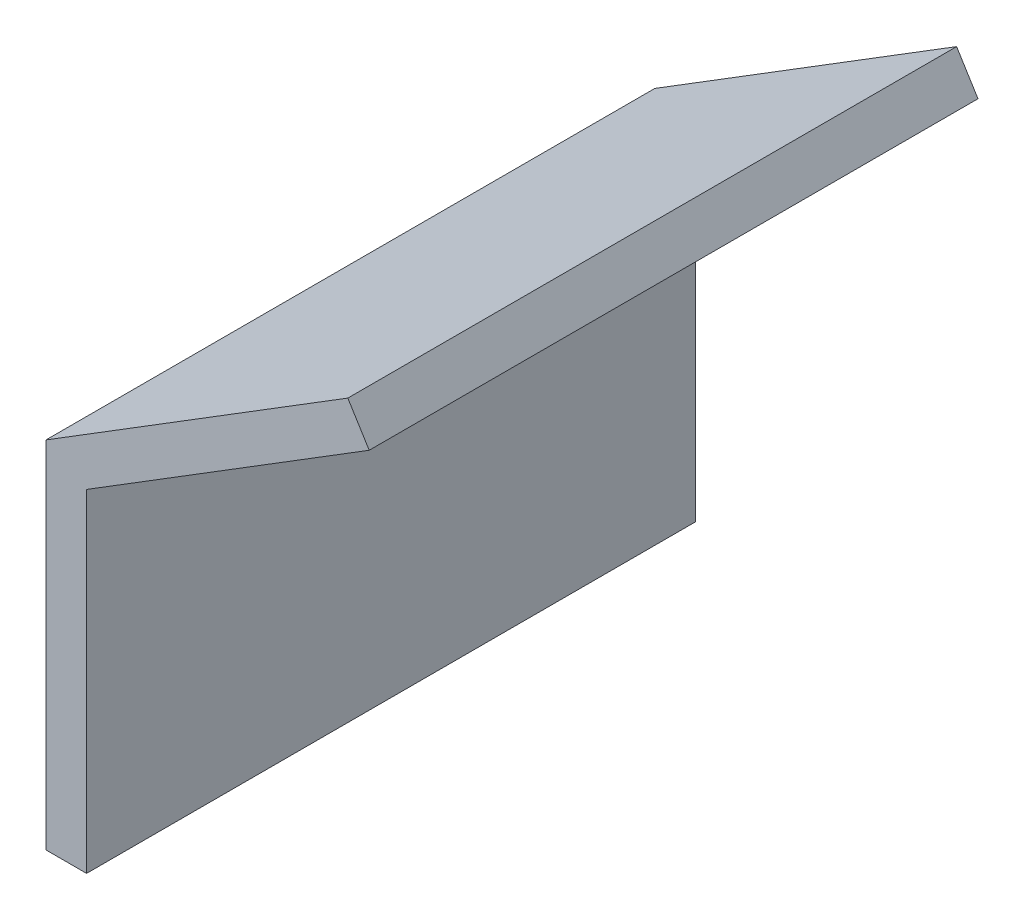
ISO-10303-21;
HEADER;
FILE_DESCRIPTION(('STEP AP214'),'2;1');
FILE_NAME('part.step','',(''),(''),'','','');
FILE_SCHEMA(('AUTOMOTIVE_DESIGN { 1 0 10303 214 1 1 1 1 }'));
ENDSEC;
DATA;
#1=APPLICATION_CONTEXT('core data for automotive mechanical design processes');
#2=APPLICATION_PROTOCOL_DEFINITION('international standard','automotive_design',2000,#1);
#3=PRODUCT_CONTEXT('',#1,'mechanical');
#4=PRODUCT('Part','Part','',(#3));
#5=PRODUCT_RELATED_PRODUCT_CATEGORY('part','',(#4));
#6=PRODUCT_DEFINITION_FORMATION('','',#4);
#7=PRODUCT_DEFINITION_CONTEXT('part definition',#1,'design');
#8=PRODUCT_DEFINITION('design','',#6,#7);
#9=PRODUCT_DEFINITION_SHAPE('','',#8);
#10=(LENGTH_UNIT() NAMED_UNIT(*) SI_UNIT(.MILLI.,.METRE.));
#11=(NAMED_UNIT(*) PLANE_ANGLE_UNIT() SI_UNIT($,.RADIAN.));
#12=(NAMED_UNIT(*) SI_UNIT($,.STERADIAN.) SOLID_ANGLE_UNIT());
#13=UNCERTAINTY_MEASURE_WITH_UNIT(LENGTH_MEASURE(1.E-05),#10,'distance_accuracy_value','');
#14=(GEOMETRIC_REPRESENTATION_CONTEXT(3) GLOBAL_UNCERTAINTY_ASSIGNED_CONTEXT((#13)) GLOBAL_UNIT_ASSIGNED_CONTEXT((#10,
#11,#12)) REPRESENTATION_CONTEXT('',''));
#15=CARTESIAN_POINT('',(0.,0.,0.));
#16=DIRECTION('',(0.,0.,1.));
#17=DIRECTION('',(1.,0.,0.));
#18=AXIS2_PLACEMENT_3D('',#15,#16,#17);
#19=CARTESIAN_POINT('',(0.,0.,60.));
#20=DIRECTION('',(1.,0.,0.));
#21=DIRECTION('',(0.,1.,0.));
#22=AXIS2_PLACEMENT_3D('',#19,#20,#21);
#23=PLANE('',#22);
#24=DIRECTION('',(0.,-1.,0.));
#25=VECTOR('',#24,1.);
#26=CARTESIAN_POINT('',(0.,0.,-60.));
#27=LINE('',#26,#25);
#28=CARTESIAN_POINT('',(0.,0.,-60.));
#29=VERTEX_POINT('',#28);
#30=CARTESIAN_POINT('',(0.,-70.,-60.));
#31=VERTEX_POINT('',#30);
#32=EDGE_CURVE('E134',#29,#31,#27,.T.);
#33=ORIENTED_EDGE('',*,*,#32,.T.);
#34=DIRECTION('',(0.,0.,-1.));
#35=VECTOR('',#34,1.);
#36=CARTESIAN_POINT('',(0.,-70.,60.));
#37=LINE('',#36,#35);
#38=CARTESIAN_POINT('',(0.,-70.,60.));
#39=VERTEX_POINT('',#38);
#40=EDGE_CURVE('E11',#39,#31,#37,.T.);
#41=ORIENTED_EDGE('',*,*,#40,.F.);
#42=DIRECTION('',(0.,-1.,0.));
#43=VECTOR('',#42,1.);
#44=CARTESIAN_POINT('',(0.,0.,60.));
#45=LINE('',#44,#43);
#46=CARTESIAN_POINT('',(0.,0.,60.));
#47=VERTEX_POINT('',#46);
#48=EDGE_CURVE('E150',#47,#39,#45,.T.);
#49=ORIENTED_EDGE('',*,*,#48,.F.);
#50=DIRECTION('',(0.,0.,-1.));
#51=VECTOR('',#50,1.);
#52=CARTESIAN_POINT('',(0.,0.,60.));
#53=LINE('',#52,#51);
#54=EDGE_CURVE('E130',#47,#29,#53,.T.);
#55=ORIENTED_EDGE('',*,*,#54,.T.);
#56=EDGE_LOOP('',(#33,#41,#49,#55));
#57=FACE_BOUND('',#56,.T.);
#58=ADVANCED_FACE('F45',(#57),#23,.F.);
#59=CARTESIAN_POINT('',(0.,-70.,60.));
#60=DIRECTION('',(0.,1.,0.));
#61=DIRECTION('',(0.,0.,1.));
#62=AXIS2_PLACEMENT_3D('',#59,#60,#61);
#63=PLANE('',#62);
#64=DIRECTION('',(1.,0.,0.));
#65=VECTOR('',#64,1.);
#66=CARTESIAN_POINT('',(0.,-70.,-60.));
#67=LINE('',#66,#65);
#68=CARTESIAN_POINT('',(8.00000000000001,-70.,-60.));
#69=VERTEX_POINT('',#68);
#70=EDGE_CURVE('E138',#31,#69,#67,.T.);
#71=ORIENTED_EDGE('',*,*,#70,.T.);
#72=DIRECTION('',(0.,0.,-1.));
#73=VECTOR('',#72,1.);
#74=CARTESIAN_POINT('',(8.00000000000001,-70.,60.));
#75=LINE('',#74,#73);
#76=CARTESIAN_POINT('',(8.00000000000001,-70.,60.));
#77=VERTEX_POINT('',#76);
#78=EDGE_CURVE('E54',#77,#69,#75,.T.);
#79=ORIENTED_EDGE('',*,*,#78,.F.);
#80=DIRECTION('',(1.,0.,0.));
#81=VECTOR('',#80,1.);
#82=CARTESIAN_POINT('',(0.,-70.,60.));
#83=LINE('',#82,#81);
#84=EDGE_CURVE('E99',#39,#77,#83,.T.);
#85=ORIENTED_EDGE('',*,*,#84,.F.);
#86=ORIENTED_EDGE('',*,*,#40,.T.);
#87=EDGE_LOOP('',(#71,#79,#85,#86));
#88=FACE_BOUND('',#87,.T.);
#89=ADVANCED_FACE('F178',(#88),#63,.F.);
#90=CARTESIAN_POINT('',(8.,-4.45274287831187,60.));
#91=DIRECTION('',(-1.,0.,0.));
#92=DIRECTION('',(0.,-1.,0.));
#93=AXIS2_PLACEMENT_3D('',#90,#91,#92);
#94=PLANE('',#93);
#95=DIRECTION('',(0.,1.,0.));
#96=VECTOR('',#95,1.);
#97=CARTESIAN_POINT('',(8.,-4.45274287831187,-60.));
#98=LINE('',#97,#96);
#99=CARTESIAN_POINT('',(8.,-4.45274287831187,-60.));
#100=VERTEX_POINT('',#99);
#101=EDGE_CURVE('E141',#69,#100,#98,.T.);
#102=ORIENTED_EDGE('',*,*,#101,.T.);
#103=DIRECTION('',(0.,0.,-1.));
#104=VECTOR('',#103,1.);
#105=CARTESIAN_POINT('',(8.,-4.45274287831187,60.));
#106=LINE('',#105,#104);
#107=CARTESIAN_POINT('',(8.,-4.45274287831187,60.));
#108=VERTEX_POINT('',#107);
#109=EDGE_CURVE('E123',#108,#100,#106,.T.);
#110=ORIENTED_EDGE('',*,*,#109,.F.);
#111=DIRECTION('',(0.,1.,0.));
#112=VECTOR('',#111,1.);
#113=CARTESIAN_POINT('',(8.,-4.45274287831187,60.));
#114=LINE('',#113,#112);
#115=EDGE_CURVE('E112',#77,#108,#114,.T.);
#116=ORIENTED_EDGE('',*,*,#115,.F.);
#117=ORIENTED_EDGE('',*,*,#78,.T.);
#118=EDGE_LOOP('',(#102,#110,#116,#117));
#119=FACE_BOUND('',#118,.T.);
#120=ADVANCED_FACE('F160',(#119),#94,.F.);
#121=CARTESIAN_POINT('',(8.,-4.45274287831187,60.));
#122=DIRECTION('',(-0.526955795496682,0.849892692986861,0.));
#123=DIRECTION('',(-0.849892692986862,-0.526955795496682,0.));
#124=AXIS2_PLACEMENT_3D('',#121,#122,#123);
#125=PLANE('',#124);
#126=DIRECTION('',(0.849892692986861,0.526955795496682,0.));
#127=VECTOR('',#126,1.);
#128=CARTESIAN_POINT('',(8.,-4.45274287831187,-60.));
#129=LINE('',#128,#127);
#130=CARTESIAN_POINT('',(63.7081348730538,30.0877641408728,-60.));
#131=VERTEX_POINT('',#130);
#132=EDGE_CURVE('E121',#100,#131,#129,.T.);
#133=ORIENTED_EDGE('',*,*,#132,.T.);
#134=DIRECTION('',(0.,0.,-1.));
#135=VECTOR('',#134,1.);
#136=CARTESIAN_POINT('',(63.7081348730538,30.0877641408728,60.));
#137=LINE('',#136,#135);
#138=CARTESIAN_POINT('',(63.7081348730538,30.0877641408728,60.));
#139=VERTEX_POINT('',#138);
#140=EDGE_CURVE('E118',#139,#131,#137,.T.);
#141=ORIENTED_EDGE('',*,*,#140,.F.);
#142=DIRECTION('',(0.849892692986861,0.526955795496682,0.));
#143=VECTOR('',#142,1.);
#144=CARTESIAN_POINT('',(8.,-4.45274287831187,60.));
#145=LINE('',#144,#143);
#146=EDGE_CURVE('E106',#108,#139,#145,.T.);
#147=ORIENTED_EDGE('',*,*,#146,.F.);
#148=ORIENTED_EDGE('',*,*,#109,.T.);
#149=EDGE_LOOP('',(#133,#141,#147,#148));
#150=FACE_BOUND('',#149,.T.);
#151=ADVANCED_FACE('F119',(#150),#125,.F.);
#152=CARTESIAN_POINT('',(59.4924885090803,36.8869056847677,60.));
#153=DIRECTION('',(-0.849892692986861,-0.526955795496682,0.));
#154=DIRECTION('',(0.526955795496682,-0.849892692986861,0.));
#155=AXIS2_PLACEMENT_3D('',#152,#153,#154);
#156=PLANE('',#155);
#157=DIRECTION('',(-0.526955795496682,0.849892692986861,0.));
#158=VECTOR('',#157,1.);
#159=CARTESIAN_POINT('',(59.4924885090803,36.8869056847677,-60.));
#160=LINE('',#159,#158);
#161=CARTESIAN_POINT('',(59.4924885090803,36.8869056847677,-60.));
#162=VERTEX_POINT('',#161);
#163=EDGE_CURVE('E85',#131,#162,#160,.T.);
#164=ORIENTED_EDGE('',*,*,#163,.T.);
#165=DIRECTION('',(0.,0.,-1.));
#166=VECTOR('',#165,1.);
#167=CARTESIAN_POINT('',(59.4924885090803,36.8869056847677,60.));
#168=LINE('',#167,#166);
#169=CARTESIAN_POINT('',(59.4924885090803,36.8869056847677,60.));
#170=VERTEX_POINT('',#169);
#171=EDGE_CURVE('E124',#170,#162,#168,.T.);
#172=ORIENTED_EDGE('',*,*,#171,.F.);
#173=DIRECTION('',(-0.526955795496682,0.849892692986861,0.));
#174=VECTOR('',#173,1.);
#175=CARTESIAN_POINT('',(59.4924885090803,36.8869056847677,60.));
#176=LINE('',#175,#174);
#177=EDGE_CURVE('E110',#139,#170,#176,.T.);
#178=ORIENTED_EDGE('',*,*,#177,.F.);
#179=ORIENTED_EDGE('',*,*,#140,.T.);
#180=EDGE_LOOP('',(#164,#172,#178,#179));
#181=FACE_BOUND('',#180,.T.);
#182=ADVANCED_FACE('F126',(#181),#156,.F.);
#183=CARTESIAN_POINT('',(0.,0.,60.));
#184=DIRECTION('',(0.526955795496682,-0.849892692986861,0.));
#185=DIRECTION('',(0.849892692986861,0.526955795496682,0.));
#186=AXIS2_PLACEMENT_3D('',#183,#184,#185);
#187=PLANE('',#186);
#188=DIRECTION('',(-0.849892692986862,-0.526955795496682,0.));
#189=VECTOR('',#188,1.);
#190=CARTESIAN_POINT('',(0.,0.,-60.));
#191=LINE('',#190,#189);
#192=EDGE_CURVE('E91',#162,#29,#191,.T.);
#193=ORIENTED_EDGE('',*,*,#192,.T.);
#194=ORIENTED_EDGE('',*,*,#54,.F.);
#195=DIRECTION('',(-0.849892692986862,-0.526955795496682,0.));
#196=VECTOR('',#195,1.);
#197=CARTESIAN_POINT('',(0.,0.,60.));
#198=LINE('',#197,#196);
#199=EDGE_CURVE('E62',#170,#47,#198,.T.);
#200=ORIENTED_EDGE('',*,*,#199,.F.);
#201=ORIENTED_EDGE('',*,*,#171,.T.);
#202=EDGE_LOOP('',(#193,#194,#200,#201));
#203=FACE_BOUND('',#202,.T.);
#204=ADVANCED_FACE('F167',(#203),#187,.F.);
#205=CARTESIAN_POINT('',(0.,0.,60.));
#206=DIRECTION('',(0.,0.,1.));
#207=DIRECTION('',(1.,0.,0.));
#208=AXIS2_PLACEMENT_3D('',#205,#206,#207);
#209=PLANE('',#208);
#210=ORIENTED_EDGE('',*,*,#48,.T.);
#211=ORIENTED_EDGE('',*,*,#84,.T.);
#212=ORIENTED_EDGE('',*,*,#115,.T.);
#213=ORIENTED_EDGE('',*,*,#146,.T.);
#214=ORIENTED_EDGE('',*,*,#177,.T.);
#215=ORIENTED_EDGE('',*,*,#199,.T.);
#216=EDGE_LOOP('',(#210,#211,#212,#213,#214,#215));
#217=FACE_BOUND('',#216,.T.);
#218=ADVANCED_FACE('F108',(#217),#209,.T.);
#219=CARTESIAN_POINT('',(0.,0.,-60.));
#220=DIRECTION('',(0.,0.,1.));
#221=DIRECTION('',(1.,0.,0.));
#222=AXIS2_PLACEMENT_3D('',#219,#220,#221);
#223=PLANE('',#222);
#224=ORIENTED_EDGE('',*,*,#32,.F.);
#225=ORIENTED_EDGE('',*,*,#192,.F.);
#226=ORIENTED_EDGE('',*,*,#163,.F.);
#227=ORIENTED_EDGE('',*,*,#132,.F.);
#228=ORIENTED_EDGE('',*,*,#101,.F.);
#229=ORIENTED_EDGE('',*,*,#70,.F.);
#230=EDGE_LOOP('',(#224,#225,#226,#227,#228,#229));
#231=FACE_BOUND('',#230,.T.);
#232=ADVANCED_FACE('F163',(#231),#223,.F.);
#233=CLOSED_SHELL('',(#58,#89,#120,#151,#182,#204,#218,#232));
#234=MANIFOLD_SOLID_BREP('B2',#233);
#235=ADVANCED_BREP_SHAPE_REPRESENTATION('',(#18,#234),#14);
#236=SHAPE_DEFINITION_REPRESENTATION(#9,#235);
ENDSEC;
END-ISO-10303-21;
